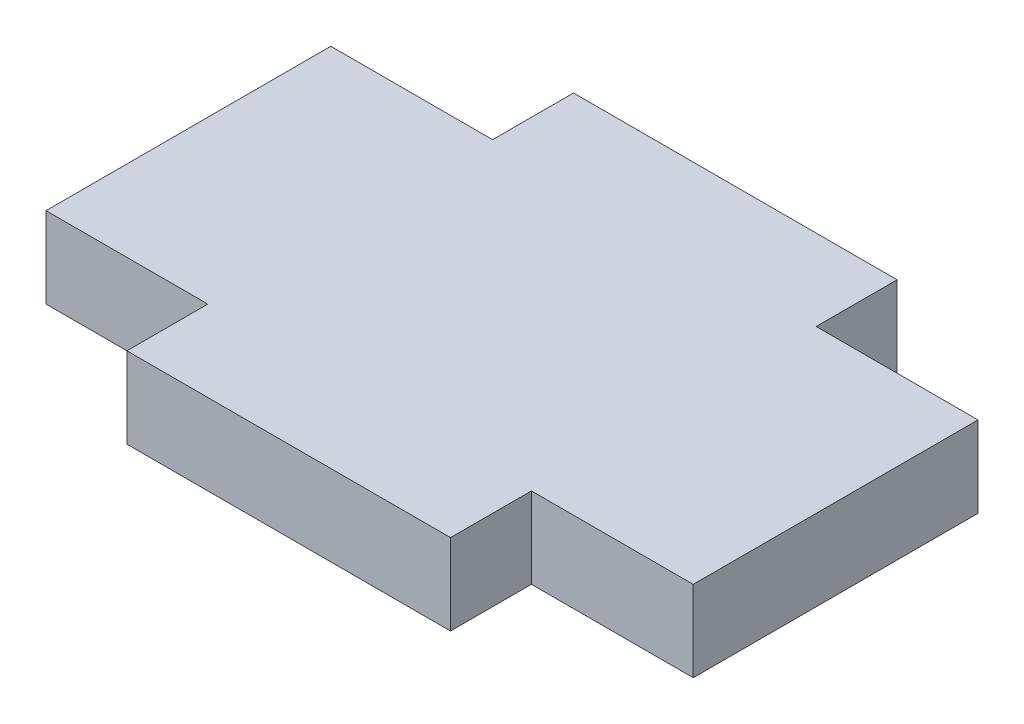
ISO-10303-21;
HEADER;
FILE_DESCRIPTION(('STEP AP214'),'2;1');
FILE_NAME('part.step','',(''),(''),'','','');
FILE_SCHEMA(('AUTOMOTIVE_DESIGN { 1 0 10303 214 1 1 1 1 }'));
ENDSEC;
DATA;
#1=APPLICATION_CONTEXT('core data for automotive mechanical design processes');
#2=APPLICATION_PROTOCOL_DEFINITION('international standard','automotive_design',2000,#1);
#3=PRODUCT_CONTEXT('',#1,'mechanical');
#4=PRODUCT('Part','Part','',(#3));
#5=PRODUCT_RELATED_PRODUCT_CATEGORY('part','',(#4));
#6=PRODUCT_DEFINITION_FORMATION('','',#4);
#7=PRODUCT_DEFINITION_CONTEXT('part definition',#1,'design');
#8=PRODUCT_DEFINITION('design','',#6,#7);
#9=PRODUCT_DEFINITION_SHAPE('','',#8);
#10=(LENGTH_UNIT() NAMED_UNIT(*) SI_UNIT(.MILLI.,.METRE.));
#11=(NAMED_UNIT(*) PLANE_ANGLE_UNIT() SI_UNIT($,.RADIAN.));
#12=(NAMED_UNIT(*) SI_UNIT($,.STERADIAN.) SOLID_ANGLE_UNIT());
#13=UNCERTAINTY_MEASURE_WITH_UNIT(LENGTH_MEASURE(1.E-05),#10,'distance_accuracy_value','');
#14=(GEOMETRIC_REPRESENTATION_CONTEXT(3) GLOBAL_UNCERTAINTY_ASSIGNED_CONTEXT((#13)) GLOBAL_UNIT_ASSIGNED_CONTEXT((#10,
#11,#12)) REPRESENTATION_CONTEXT('',''));
#15=CARTESIAN_POINT('',(0.,0.,0.));
#16=DIRECTION('',(0.,0.,1.));
#17=DIRECTION('',(1.,0.,0.));
#18=AXIS2_PLACEMENT_3D('',#15,#16,#17);
#19=CARTESIAN_POINT('',(19.05,3.175,0.));
#20=DIRECTION('',(-1.,0.,0.));
#21=DIRECTION('',(0.,0.,1.));
#22=AXIS2_PLACEMENT_3D('',#19,#20,#21);
#23=PLANE('',#22);
#24=DIRECTION('',(0.,0.,-1.));
#25=VECTOR('',#24,1.);
#26=CARTESIAN_POINT('',(19.05,0.,0.));
#27=LINE('',#26,#25);
#28=CARTESIAN_POINT('',(19.05,0.,-11.176));
#29=VERTEX_POINT('',#28);
#30=CARTESIAN_POINT('',(19.05,0.,-14.351));
#31=VERTEX_POINT('',#30);
#32=EDGE_CURVE('E157',#29,#31,#27,.T.);
#33=ORIENTED_EDGE('',*,*,#32,.T.);
#34=DIRECTION('',(0.,-1.,0.));
#35=VECTOR('',#34,1.);
#36=CARTESIAN_POINT('',(19.05,3.175,-14.351));
#37=LINE('',#36,#35);
#38=CARTESIAN_POINT('',(19.05,3.175,-14.351));
#39=VERTEX_POINT('',#38);
#40=EDGE_CURVE('E11',#39,#31,#37,.T.);
#41=ORIENTED_EDGE('',*,*,#40,.F.);
#42=DIRECTION('',(0.,0.,-1.));
#43=VECTOR('',#42,1.);
#44=CARTESIAN_POINT('',(19.05,3.175,0.));
#45=LINE('',#44,#43);
#46=CARTESIAN_POINT('',(19.05,3.175,-11.176));
#47=VERTEX_POINT('',#46);
#48=EDGE_CURVE('E221',#47,#39,#45,.T.);
#49=ORIENTED_EDGE('',*,*,#48,.F.);
#50=DIRECTION('',(0.,-1.,0.));
#51=VECTOR('',#50,1.);
#52=CARTESIAN_POINT('',(19.05,3.175,-11.176));
#53=LINE('',#52,#51);
#54=EDGE_CURVE('E49',#47,#29,#53,.T.);
#55=ORIENTED_EDGE('',*,*,#54,.T.);
#56=EDGE_LOOP('',(#33,#41,#49,#55));
#57=FACE_BOUND('',#56,.T.);
#58=ADVANCED_FACE('F33',(#57),#23,.F.);
#59=CARTESIAN_POINT('',(0.,3.175,-14.351));
#60=DIRECTION('',(0.,0.,1.));
#61=DIRECTION('',(1.,0.,0.));
#62=AXIS2_PLACEMENT_3D('',#59,#60,#61);
#63=PLANE('',#62);
#64=DIRECTION('',(-1.,0.,0.));
#65=VECTOR('',#64,1.);
#66=CARTESIAN_POINT('',(0.,0.,-14.351));
#67=LINE('',#66,#65);
#68=CARTESIAN_POINT('',(6.35,0.,-14.351));
#69=VERTEX_POINT('',#68);
#70=EDGE_CURVE('E159',#31,#69,#67,.T.);
#71=ORIENTED_EDGE('',*,*,#70,.T.);
#72=DIRECTION('',(0.,-1.,0.));
#73=VECTOR('',#72,1.);
#74=CARTESIAN_POINT('',(6.35,3.175,-14.351));
#75=LINE('',#74,#73);
#76=CARTESIAN_POINT('',(6.35,3.175,-14.351));
#77=VERTEX_POINT('',#76);
#78=EDGE_CURVE('E41',#77,#69,#75,.T.);
#79=ORIENTED_EDGE('',*,*,#78,.F.);
#80=DIRECTION('',(-1.,0.,0.));
#81=VECTOR('',#80,1.);
#82=CARTESIAN_POINT('',(0.,3.175,-14.351));
#83=LINE('',#82,#81);
#84=EDGE_CURVE('E100',#39,#77,#83,.T.);
#85=ORIENTED_EDGE('',*,*,#84,.F.);
#86=ORIENTED_EDGE('',*,*,#40,.T.);
#87=EDGE_LOOP('',(#71,#79,#85,#86));
#88=FACE_BOUND('',#87,.T.);
#89=ADVANCED_FACE('F206',(#88),#63,.F.);
#90=CARTESIAN_POINT('',(6.35,3.175,0.));
#91=DIRECTION('',(-1.,0.,0.));
#92=DIRECTION('',(0.,0.,1.));
#93=AXIS2_PLACEMENT_3D('',#90,#91,#92);
#94=PLANE('',#93);
#95=DIRECTION('',(0.,0.,-1.));
#96=VECTOR('',#95,1.);
#97=CARTESIAN_POINT('',(6.35,0.,0.));
#98=LINE('',#97,#96);
#99=CARTESIAN_POINT('',(6.35,0.,-11.176));
#100=VERTEX_POINT('',#99);
#101=EDGE_CURVE('E162',#100,#69,#98,.T.);
#102=ORIENTED_EDGE('',*,*,#101,.F.);
#103=DIRECTION('',(0.,-1.,0.));
#104=VECTOR('',#103,1.);
#105=CARTESIAN_POINT('',(6.35,3.175,-11.176));
#106=LINE('',#105,#104);
#107=CARTESIAN_POINT('',(6.35,3.175,-11.176));
#108=VERTEX_POINT('',#107);
#109=EDGE_CURVE('E199',#108,#100,#106,.T.);
#110=ORIENTED_EDGE('',*,*,#109,.F.);
#111=DIRECTION('',(0.,0.,-1.));
#112=VECTOR('',#111,1.);
#113=CARTESIAN_POINT('',(6.35,3.175,0.));
#114=LINE('',#113,#112);
#115=EDGE_CURVE('E205',#108,#77,#114,.T.);
#116=ORIENTED_EDGE('',*,*,#115,.T.);
#117=ORIENTED_EDGE('',*,*,#78,.T.);
#118=EDGE_LOOP('',(#102,#110,#116,#117));
#119=FACE_BOUND('',#118,.T.);
#120=ADVANCED_FACE('F203',(#119),#94,.T.);
#121=CARTESIAN_POINT('',(0.,3.175,-11.176));
#122=DIRECTION('',(0.,0.,-1.));
#123=DIRECTION('',(-1.,0.,0.));
#124=AXIS2_PLACEMENT_3D('',#121,#122,#123);
#125=PLANE('',#124);
#126=DIRECTION('',(1.,0.,0.));
#127=VECTOR('',#126,1.);
#128=CARTESIAN_POINT('',(0.,0.,-11.176));
#129=LINE('',#128,#127);
#130=CARTESIAN_POINT('',(0.,0.,-11.176));
#131=VERTEX_POINT('',#130);
#132=EDGE_CURVE('E165',#131,#100,#129,.T.);
#133=ORIENTED_EDGE('',*,*,#132,.F.);
#134=DIRECTION('',(0.,-1.,0.));
#135=VECTOR('',#134,1.);
#136=CARTESIAN_POINT('',(0.,3.175,-11.176));
#137=LINE('',#136,#135);
#138=CARTESIAN_POINT('',(0.,3.175,-11.176));
#139=VERTEX_POINT('',#138);
#140=EDGE_CURVE('E197',#139,#131,#137,.T.);
#141=ORIENTED_EDGE('',*,*,#140,.F.);
#142=DIRECTION('',(1.,0.,0.));
#143=VECTOR('',#142,1.);
#144=CARTESIAN_POINT('',(0.,3.175,-11.176));
#145=LINE('',#144,#143);
#146=EDGE_CURVE('E153',#139,#108,#145,.T.);
#147=ORIENTED_EDGE('',*,*,#146,.T.);
#148=ORIENTED_EDGE('',*,*,#109,.T.);
#149=EDGE_LOOP('',(#133,#141,#147,#148));
#150=FACE_BOUND('',#149,.T.);
#151=ADVANCED_FACE('F214',(#150),#125,.T.);
#152=CARTESIAN_POINT('',(0.,3.175,0.));
#153=DIRECTION('',(-1.,0.,0.));
#154=DIRECTION('',(0.,0.,1.));
#155=AXIS2_PLACEMENT_3D('',#152,#153,#154);
#156=PLANE('',#155);
#157=DIRECTION('',(0.,0.,-1.));
#158=VECTOR('',#157,1.);
#159=CARTESIAN_POINT('',(0.,0.,0.));
#160=LINE('',#159,#158);
#161=CARTESIAN_POINT('',(0.,0.,0.));
#162=VERTEX_POINT('',#161);
#163=EDGE_CURVE('E168',#162,#131,#160,.T.);
#164=ORIENTED_EDGE('',*,*,#163,.F.);
#165=DIRECTION('',(0.,-1.,0.));
#166=VECTOR('',#165,1.);
#167=CARTESIAN_POINT('',(0.,3.175,0.));
#168=LINE('',#167,#166);
#169=CARTESIAN_POINT('',(0.,3.175,0.));
#170=VERTEX_POINT('',#169);
#171=EDGE_CURVE('E195',#170,#162,#168,.T.);
#172=ORIENTED_EDGE('',*,*,#171,.F.);
#173=DIRECTION('',(0.,0.,-1.));
#174=VECTOR('',#173,1.);
#175=CARTESIAN_POINT('',(0.,3.175,0.));
#176=LINE('',#175,#174);
#177=EDGE_CURVE('E220',#170,#139,#176,.T.);
#178=ORIENTED_EDGE('',*,*,#177,.T.);
#179=ORIENTED_EDGE('',*,*,#140,.T.);
#180=EDGE_LOOP('',(#164,#172,#178,#179));
#181=FACE_BOUND('',#180,.T.);
#182=ADVANCED_FACE('F244',(#181),#156,.T.);
#183=CARTESIAN_POINT('',(0.,3.175,0.));
#184=DIRECTION('',(0.,0.,-1.));
#185=DIRECTION('',(-1.,0.,0.));
#186=AXIS2_PLACEMENT_3D('',#183,#184,#185);
#187=PLANE('',#186);
#188=DIRECTION('',(1.,0.,0.));
#189=VECTOR('',#188,1.);
#190=CARTESIAN_POINT('',(0.,0.,0.));
#191=LINE('',#190,#189);
#192=CARTESIAN_POINT('',(6.35,0.,0.));
#193=VERTEX_POINT('',#192);
#194=EDGE_CURVE('E172',#162,#193,#191,.T.);
#195=ORIENTED_EDGE('',*,*,#194,.T.);
#196=DIRECTION('',(0.,-1.,0.));
#197=VECTOR('',#196,1.);
#198=CARTESIAN_POINT('',(6.35,3.175,0.));
#199=LINE('',#198,#197);
#200=CARTESIAN_POINT('',(6.35,3.175,0.));
#201=VERTEX_POINT('',#200);
#202=EDGE_CURVE('E192',#201,#193,#199,.T.);
#203=ORIENTED_EDGE('',*,*,#202,.F.);
#204=DIRECTION('',(1.,0.,0.));
#205=VECTOR('',#204,1.);
#206=CARTESIAN_POINT('',(0.,3.175,0.));
#207=LINE('',#206,#205);
#208=EDGE_CURVE('E139',#170,#201,#207,.T.);
#209=ORIENTED_EDGE('',*,*,#208,.F.);
#210=ORIENTED_EDGE('',*,*,#171,.T.);
#211=EDGE_LOOP('',(#195,#203,#209,#210));
#212=FACE_BOUND('',#211,.T.);
#213=ADVANCED_FACE('F247',(#212),#187,.F.);
#214=CARTESIAN_POINT('',(6.35,3.175,0.));
#215=DIRECTION('',(1.,0.,0.));
#216=DIRECTION('',(0.,0.,-1.));
#217=AXIS2_PLACEMENT_3D('',#214,#215,#216);
#218=PLANE('',#217);
#219=DIRECTION('',(0.,0.,1.));
#220=VECTOR('',#219,1.);
#221=CARTESIAN_POINT('',(6.35,0.,0.));
#222=LINE('',#221,#220);
#223=CARTESIAN_POINT('',(6.35,0.,3.175));
#224=VERTEX_POINT('',#223);
#225=EDGE_CURVE('E174',#193,#224,#222,.T.);
#226=ORIENTED_EDGE('',*,*,#225,.T.);
#227=DIRECTION('',(0.,-1.,0.));
#228=VECTOR('',#227,1.);
#229=CARTESIAN_POINT('',(6.35,3.175,3.175));
#230=LINE('',#229,#228);
#231=CARTESIAN_POINT('',(6.35,3.175,3.175));
#232=VERTEX_POINT('',#231);
#233=EDGE_CURVE('E190',#232,#224,#230,.T.);
#234=ORIENTED_EDGE('',*,*,#233,.F.);
#235=DIRECTION('',(0.,0.,1.));
#236=VECTOR('',#235,1.);
#237=CARTESIAN_POINT('',(6.35,3.175,0.));
#238=LINE('',#237,#236);
#239=EDGE_CURVE('E226',#201,#232,#238,.T.);
#240=ORIENTED_EDGE('',*,*,#239,.F.);
#241=ORIENTED_EDGE('',*,*,#202,.T.);
#242=EDGE_LOOP('',(#226,#234,#240,#241));
#243=FACE_BOUND('',#242,.T.);
#244=ADVANCED_FACE('F249',(#243),#218,.F.);
#245=CARTESIAN_POINT('',(0.,3.175,3.175));
#246=DIRECTION('',(0.,0.,1.));
#247=DIRECTION('',(1.,0.,0.));
#248=AXIS2_PLACEMENT_3D('',#245,#246,#247);
#249=PLANE('',#248);
#250=DIRECTION('',(-1.,0.,0.));
#251=VECTOR('',#250,1.);
#252=CARTESIAN_POINT('',(0.,0.,3.175));
#253=LINE('',#252,#251);
#254=CARTESIAN_POINT('',(19.05,0.,3.175));
#255=VERTEX_POINT('',#254);
#256=EDGE_CURVE('E177',#255,#224,#253,.T.);
#257=ORIENTED_EDGE('',*,*,#256,.F.);
#258=DIRECTION('',(0.,-1.,0.));
#259=VECTOR('',#258,1.);
#260=CARTESIAN_POINT('',(19.05,3.175,3.175));
#261=LINE('',#260,#259);
#262=CARTESIAN_POINT('',(19.05,3.175,3.175));
#263=VERTEX_POINT('',#262);
#264=EDGE_CURVE('E188',#263,#255,#261,.T.);
#265=ORIENTED_EDGE('',*,*,#264,.F.);
#266=DIRECTION('',(-1.,0.,0.));
#267=VECTOR('',#266,1.);
#268=CARTESIAN_POINT('',(0.,3.175,3.175));
#269=LINE('',#268,#267);
#270=EDGE_CURVE('E227',#263,#232,#269,.T.);
#271=ORIENTED_EDGE('',*,*,#270,.T.);
#272=ORIENTED_EDGE('',*,*,#233,.T.);
#273=EDGE_LOOP('',(#257,#265,#271,#272));
#274=FACE_BOUND('',#273,.T.);
#275=ADVANCED_FACE('F252',(#274),#249,.T.);
#276=CARTESIAN_POINT('',(19.05,3.175,0.));
#277=DIRECTION('',(1.,0.,0.));
#278=DIRECTION('',(0.,0.,-1.));
#279=AXIS2_PLACEMENT_3D('',#276,#277,#278);
#280=PLANE('',#279);
#281=DIRECTION('',(0.,0.,1.));
#282=VECTOR('',#281,1.);
#283=CARTESIAN_POINT('',(19.05,0.,0.));
#284=LINE('',#283,#282);
#285=CARTESIAN_POINT('',(19.05,0.,0.));
#286=VERTEX_POINT('',#285);
#287=EDGE_CURVE('E180',#286,#255,#284,.T.);
#288=ORIENTED_EDGE('',*,*,#287,.F.);
#289=DIRECTION('',(0.,-1.,0.));
#290=VECTOR('',#289,1.);
#291=CARTESIAN_POINT('',(19.05,3.175,0.));
#292=LINE('',#291,#290);
#293=CARTESIAN_POINT('',(19.05,3.175,0.));
#294=VERTEX_POINT('',#293);
#295=EDGE_CURVE('E147',#294,#286,#292,.T.);
#296=ORIENTED_EDGE('',*,*,#295,.F.);
#297=DIRECTION('',(0.,0.,1.));
#298=VECTOR('',#297,1.);
#299=CARTESIAN_POINT('',(19.05,3.175,0.));
#300=LINE('',#299,#298);
#301=EDGE_CURVE('E136',#294,#263,#300,.T.);
#302=ORIENTED_EDGE('',*,*,#301,.T.);
#303=ORIENTED_EDGE('',*,*,#264,.T.);
#304=EDGE_LOOP('',(#288,#296,#302,#303));
#305=FACE_BOUND('',#304,.T.);
#306=ADVANCED_FACE('F232',(#305),#280,.T.);
#307=CARTESIAN_POINT('',(25.4,0.,0.));
#308=VERTEX_POINT('',#307);
#309=EDGE_CURVE('E144',#286,#308,#191,.T.);
#310=ORIENTED_EDGE('',*,*,#309,.T.);
#311=DIRECTION('',(0.,-1.,0.));
#312=VECTOR('',#311,1.);
#313=CARTESIAN_POINT('',(25.4,3.175,0.));
#314=LINE('',#313,#312);
#315=CARTESIAN_POINT('',(25.4,3.175,0.));
#316=VERTEX_POINT('',#315);
#317=EDGE_CURVE('E141',#316,#308,#314,.T.);
#318=ORIENTED_EDGE('',*,*,#317,.F.);
#319=EDGE_CURVE('E128',#294,#316,#207,.T.);
#320=ORIENTED_EDGE('',*,*,#319,.F.);
#321=ORIENTED_EDGE('',*,*,#295,.T.);
#322=EDGE_LOOP('',(#310,#318,#320,#321));
#323=FACE_BOUND('',#322,.T.);
#324=ADVANCED_FACE('F142',(#323),#187,.F.);
#325=CARTESIAN_POINT('',(25.4,3.175,0.));
#326=DIRECTION('',(-1.,0.,0.));
#327=DIRECTION('',(0.,0.,1.));
#328=AXIS2_PLACEMENT_3D('',#325,#326,#327);
#329=PLANE('',#328);
#330=DIRECTION('',(0.,0.,-1.));
#331=VECTOR('',#330,1.);
#332=CARTESIAN_POINT('',(25.4,0.,0.));
#333=LINE('',#332,#331);
#334=CARTESIAN_POINT('',(25.4,0.,-11.176));
#335=VERTEX_POINT('',#334);
#336=EDGE_CURVE('E183',#308,#335,#333,.T.);
#337=ORIENTED_EDGE('',*,*,#336,.T.);
#338=DIRECTION('',(0.,-1.,0.));
#339=VECTOR('',#338,1.);
#340=CARTESIAN_POINT('',(25.4,3.175,-11.176));
#341=LINE('',#340,#339);
#342=CARTESIAN_POINT('',(25.4,3.175,-11.176));
#343=VERTEX_POINT('',#342);
#344=EDGE_CURVE('E88',#343,#335,#341,.T.);
#345=ORIENTED_EDGE('',*,*,#344,.F.);
#346=DIRECTION('',(0.,0.,-1.));
#347=VECTOR('',#346,1.);
#348=CARTESIAN_POINT('',(25.4,3.175,0.));
#349=LINE('',#348,#347);
#350=EDGE_CURVE('E133',#316,#343,#349,.T.);
#351=ORIENTED_EDGE('',*,*,#350,.F.);
#352=ORIENTED_EDGE('',*,*,#317,.T.);
#353=EDGE_LOOP('',(#337,#345,#351,#352));
#354=FACE_BOUND('',#353,.T.);
#355=ADVANCED_FACE('F149',(#354),#329,.F.);
#356=EDGE_CURVE('E169',#29,#335,#129,.T.);
#357=ORIENTED_EDGE('',*,*,#356,.F.);
#358=ORIENTED_EDGE('',*,*,#54,.F.);
#359=EDGE_CURVE('E150',#47,#343,#145,.T.);
#360=ORIENTED_EDGE('',*,*,#359,.T.);
#361=ORIENTED_EDGE('',*,*,#344,.T.);
#362=EDGE_LOOP('',(#357,#358,#360,#361));
#363=FACE_BOUND('',#362,.T.);
#364=ADVANCED_FACE('F262',(#363),#125,.T.);
#365=CARTESIAN_POINT('',(0.,3.175,0.));
#366=DIRECTION('',(0.,1.,0.));
#367=DIRECTION('',(0.,0.,1.));
#368=AXIS2_PLACEMENT_3D('',#365,#366,#367);
#369=PLANE('',#368);
#370=ORIENTED_EDGE('',*,*,#48,.T.);
#371=ORIENTED_EDGE('',*,*,#84,.T.);
#372=ORIENTED_EDGE('',*,*,#115,.F.);
#373=ORIENTED_EDGE('',*,*,#146,.F.);
#374=ORIENTED_EDGE('',*,*,#177,.F.);
#375=ORIENTED_EDGE('',*,*,#208,.T.);
#376=ORIENTED_EDGE('',*,*,#239,.T.);
#377=ORIENTED_EDGE('',*,*,#270,.F.);
#378=ORIENTED_EDGE('',*,*,#301,.F.);
#379=ORIENTED_EDGE('',*,*,#319,.T.);
#380=ORIENTED_EDGE('',*,*,#350,.T.);
#381=ORIENTED_EDGE('',*,*,#359,.F.);
#382=EDGE_LOOP('',(#370,#371,#372,#373,#374,#375,#376,#377,#378,#379,#380,#381));
#383=FACE_BOUND('',#382,.T.);
#384=ADVANCED_FACE('F130',(#383),#369,.T.);
#385=CARTESIAN_POINT('',(0.,0.,0.));
#386=DIRECTION('',(0.,1.,0.));
#387=DIRECTION('',(0.,0.,1.));
#388=AXIS2_PLACEMENT_3D('',#385,#386,#387);
#389=PLANE('',#388);
#390=ORIENTED_EDGE('',*,*,#32,.F.);
#391=ORIENTED_EDGE('',*,*,#356,.T.);
#392=ORIENTED_EDGE('',*,*,#336,.F.);
#393=ORIENTED_EDGE('',*,*,#309,.F.);
#394=ORIENTED_EDGE('',*,*,#287,.T.);
#395=ORIENTED_EDGE('',*,*,#256,.T.);
#396=ORIENTED_EDGE('',*,*,#225,.F.);
#397=ORIENTED_EDGE('',*,*,#194,.F.);
#398=ORIENTED_EDGE('',*,*,#163,.T.);
#399=ORIENTED_EDGE('',*,*,#132,.T.);
#400=ORIENTED_EDGE('',*,*,#101,.T.);
#401=ORIENTED_EDGE('',*,*,#70,.F.);
#402=EDGE_LOOP('',(#390,#391,#392,#393,#394,#395,#396,#397,#398,#399,#400,#401));
#403=FACE_BOUND('',#402,.T.);
#404=ADVANCED_FACE('F209',(#403),#389,.F.);
#405=CLOSED_SHELL('',(#58,#89,#120,#151,#182,#213,#244,#275,#306,#324,#355,#364,#384,#404));
#406=MANIFOLD_SOLID_BREP('B2',#405);
#407=ADVANCED_BREP_SHAPE_REPRESENTATION('',(#18,#406),#14);
#408=SHAPE_DEFINITION_REPRESENTATION(#9,#407);
ENDSEC;
END-ISO-10303-21;
